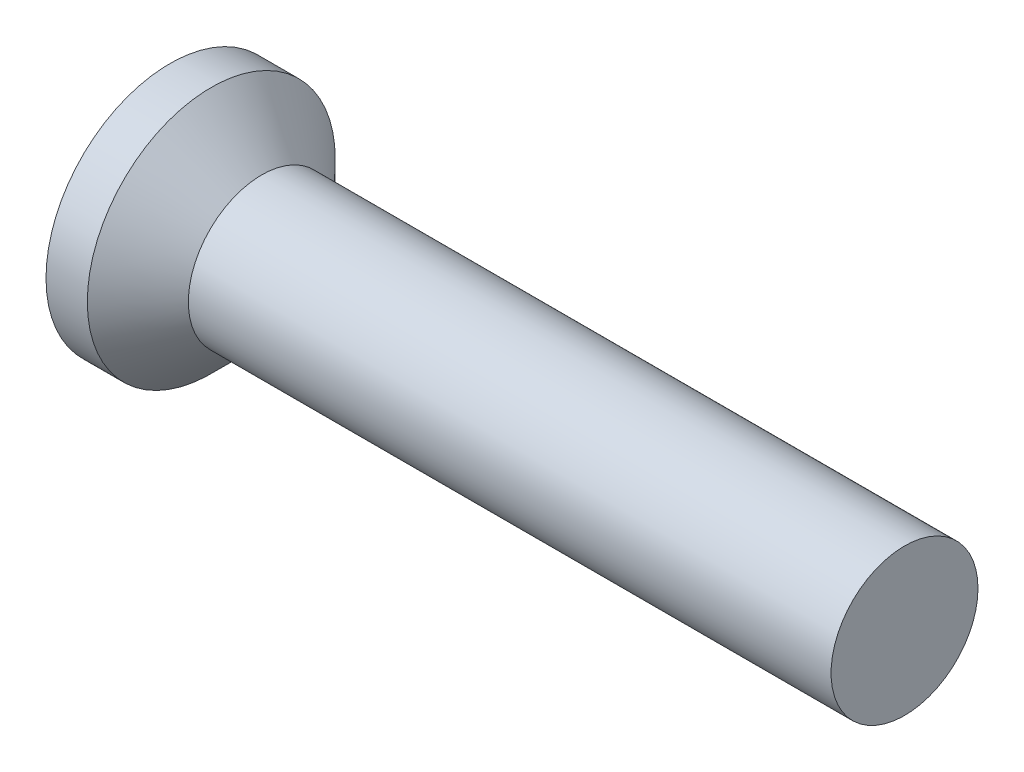
ISO-10303-21;
HEADER;
FILE_DESCRIPTION(('STEP AP214'),'2;1');
FILE_NAME('part.step','',(''),(''),'','','');
FILE_SCHEMA(('AUTOMOTIVE_DESIGN { 1 0 10303 214 1 1 1 1 }'));
ENDSEC;
DATA;
#1=APPLICATION_CONTEXT('core data for automotive mechanical design processes');
#2=APPLICATION_PROTOCOL_DEFINITION('international standard','automotive_design',2000,#1);
#3=PRODUCT_CONTEXT('',#1,'mechanical');
#4=PRODUCT('Part','Part','',(#3));
#5=PRODUCT_RELATED_PRODUCT_CATEGORY('part','',(#4));
#6=PRODUCT_DEFINITION_FORMATION('','',#4);
#7=PRODUCT_DEFINITION_CONTEXT('part definition',#1,'design');
#8=PRODUCT_DEFINITION('design','',#6,#7);
#9=PRODUCT_DEFINITION_SHAPE('','',#8);
#10=(LENGTH_UNIT() NAMED_UNIT(*) SI_UNIT(.MILLI.,.METRE.));
#11=(NAMED_UNIT(*) PLANE_ANGLE_UNIT() SI_UNIT($,.RADIAN.));
#12=(NAMED_UNIT(*) SI_UNIT($,.STERADIAN.) SOLID_ANGLE_UNIT());
#13=UNCERTAINTY_MEASURE_WITH_UNIT(LENGTH_MEASURE(1.E-05),#10,'distance_accuracy_value','');
#14=(GEOMETRIC_REPRESENTATION_CONTEXT(3) GLOBAL_UNCERTAINTY_ASSIGNED_CONTEXT((#13)) GLOBAL_UNIT_ASSIGNED_CONTEXT((#10,
#11,#12)) REPRESENTATION_CONTEXT('',''));
#15=CARTESIAN_POINT('',(0.,0.,0.));
#16=DIRECTION('',(0.,0.,1.));
#17=DIRECTION('',(1.,0.,0.));
#18=AXIS2_PLACEMENT_3D('',#15,#16,#17);
#19=CARTESIAN_POINT('',(0.,1.34999999999999,0.));
#20=DIRECTION('',(-1.,0.,0.));
#21=DIRECTION('',(0.,0.,1.));
#22=AXIS2_PLACEMENT_3D('',#19,#20,#21);
#23=PLANE('',#22);
#24=CARTESIAN_POINT('',(0.,0.,0.));
#25=DIRECTION('',(1.,0.,0.));
#26=DIRECTION('',(0.,0.,-1.));
#27=AXIS2_PLACEMENT_3D('',#24,#25,#26);
#28=CIRCLE('',#27,1.34999999999999);
#29=CARTESIAN_POINT('',(0.,0.,-1.34999999999999));
#30=VERTEX_POINT('',#29);
#31=EDGE_CURVE('E185',#30,#30,#28,.T.);
#32=ORIENTED_EDGE('',*,*,#31,.F.);
#33=EDGE_LOOP('',(#32));
#34=FACE_BOUND('',#33,.T.);
#35=DIRECTION('',(0.,1.,0.));
#36=VECTOR('',#35,1.);
#37=CARTESIAN_POINT('',(0.,-0.16,-0.16));
#38=LINE('',#37,#36);
#39=CARTESIAN_POINT('',(0.,-0.8,-0.16));
#40=VERTEX_POINT('',#39);
#41=CARTESIAN_POINT('',(0.,-0.46,-0.16));
#42=VERTEX_POINT('',#41);
#43=EDGE_CURVE('E311',#40,#42,#38,.T.);
#44=ORIENTED_EDGE('',*,*,#43,.T.);
#45=CARTESIAN_POINT('',(0.,-0.46,-0.46));
#46=DIRECTION('',(-1.,0.,0.));
#47=DIRECTION('',(0.,0.,1.));
#48=AXIS2_PLACEMENT_3D('',#45,#46,#47);
#49=CIRCLE('',#48,0.3);
#50=CARTESIAN_POINT('',(0.,-0.16,-0.46));
#51=VERTEX_POINT('',#50);
#52=EDGE_CURVE('E190',#42,#51,#49,.T.);
#53=ORIENTED_EDGE('',*,*,#52,.T.);
#54=DIRECTION('',(0.,0.,-1.));
#55=VECTOR('',#54,1.);
#56=CARTESIAN_POINT('',(0.,-0.16,-0.16));
#57=LINE('',#56,#55);
#58=CARTESIAN_POINT('',(0.,-0.16,-0.8));
#59=VERTEX_POINT('',#58);
#60=EDGE_CURVE('E313',#51,#59,#57,.T.);
#61=ORIENTED_EDGE('',*,*,#60,.T.);
#62=DIRECTION('',(0.,1.,0.));
#63=VECTOR('',#62,1.);
#64=CARTESIAN_POINT('',(0.,0.16,-0.8));
#65=LINE('',#64,#63);
#66=CARTESIAN_POINT('',(0.,0.16,-0.8));
#67=VERTEX_POINT('',#66);
#68=EDGE_CURVE('E315',#59,#67,#65,.T.);
#69=ORIENTED_EDGE('',*,*,#68,.T.);
#70=DIRECTION('',(0.,0.,1.));
#71=VECTOR('',#70,1.);
#72=CARTESIAN_POINT('',(0.,0.16,-0.16));
#73=LINE('',#72,#71);
#74=CARTESIAN_POINT('',(0.,0.16,-0.46));
#75=VERTEX_POINT('',#74);
#76=EDGE_CURVE('E318',#67,#75,#73,.T.);
#77=ORIENTED_EDGE('',*,*,#76,.T.);
#78=CARTESIAN_POINT('',(0.,0.46,-0.46));
#79=DIRECTION('',(-1.,0.,0.));
#80=DIRECTION('',(0.,0.,1.));
#81=AXIS2_PLACEMENT_3D('',#78,#79,#80);
#82=CIRCLE('',#81,0.3);
#83=CARTESIAN_POINT('',(0.,0.46,-0.16));
#84=VERTEX_POINT('',#83);
#85=EDGE_CURVE('E188',#75,#84,#82,.T.);
#86=ORIENTED_EDGE('',*,*,#85,.T.);
#87=DIRECTION('',(0.,1.,0.));
#88=VECTOR('',#87,1.);
#89=CARTESIAN_POINT('',(0.,0.16,-0.16));
#90=LINE('',#89,#88);
#91=CARTESIAN_POINT('',(0.,0.8,-0.16));
#92=VERTEX_POINT('',#91);
#93=EDGE_CURVE('E321',#84,#92,#90,.T.);
#94=ORIENTED_EDGE('',*,*,#93,.T.);
#95=DIRECTION('',(0.,0.,1.));
#96=VECTOR('',#95,1.);
#97=CARTESIAN_POINT('',(0.,0.8,-0.16));
#98=LINE('',#97,#96);
#99=CARTESIAN_POINT('',(0.,0.8,0.16));
#100=VERTEX_POINT('',#99);
#101=EDGE_CURVE('E323',#92,#100,#98,.T.);
#102=ORIENTED_EDGE('',*,*,#101,.T.);
#103=DIRECTION('',(0.,-1.,0.));
#104=VECTOR('',#103,1.);
#105=CARTESIAN_POINT('',(0.,0.16,0.16));
#106=LINE('',#105,#104);
#107=CARTESIAN_POINT('',(0.,0.46,0.16));
#108=VERTEX_POINT('',#107);
#109=EDGE_CURVE('E326',#100,#108,#106,.T.);
#110=ORIENTED_EDGE('',*,*,#109,.T.);
#111=CARTESIAN_POINT('',(0.,0.46,0.46));
#112=DIRECTION('',(-1.,0.,0.));
#113=DIRECTION('',(0.,0.,1.));
#114=AXIS2_PLACEMENT_3D('',#111,#112,#113);
#115=CIRCLE('',#114,0.3);
#116=CARTESIAN_POINT('',(0.,0.16,0.46));
#117=VERTEX_POINT('',#116);
#118=EDGE_CURVE('E153',#108,#117,#115,.T.);
#119=ORIENTED_EDGE('',*,*,#118,.T.);
#120=DIRECTION('',(0.,0.,1.));
#121=VECTOR('',#120,1.);
#122=CARTESIAN_POINT('',(0.,0.16,0.16));
#123=LINE('',#122,#121);
#124=CARTESIAN_POINT('',(0.,0.16,0.8));
#125=VERTEX_POINT('',#124);
#126=EDGE_CURVE('E147',#117,#125,#123,.T.);
#127=ORIENTED_EDGE('',*,*,#126,.T.);
#128=DIRECTION('',(0.,-1.,0.));
#129=VECTOR('',#128,1.);
#130=CARTESIAN_POINT('',(0.,0.16,0.8));
#131=LINE('',#130,#129);
#132=CARTESIAN_POINT('',(0.,-0.16,0.8));
#133=VERTEX_POINT('',#132);
#134=EDGE_CURVE('E151',#125,#133,#131,.T.);
#135=ORIENTED_EDGE('',*,*,#134,.T.);
#136=DIRECTION('',(0.,0.,-1.));
#137=VECTOR('',#136,1.);
#138=CARTESIAN_POINT('',(0.,-0.16,0.16));
#139=LINE('',#138,#137);
#140=CARTESIAN_POINT('',(0.,-0.16,0.46));
#141=VERTEX_POINT('',#140);
#142=EDGE_CURVE('E165',#133,#141,#139,.T.);
#143=ORIENTED_EDGE('',*,*,#142,.T.);
#144=CARTESIAN_POINT('',(0.,-0.46,0.46));
#145=DIRECTION('',(-1.,0.,0.));
#146=DIRECTION('',(0.,0.,1.));
#147=AXIS2_PLACEMENT_3D('',#144,#145,#146);
#148=CIRCLE('',#147,0.3);
#149=CARTESIAN_POINT('',(0.,-0.46,0.16));
#150=VERTEX_POINT('',#149);
#151=EDGE_CURVE('E184',#141,#150,#148,.T.);
#152=ORIENTED_EDGE('',*,*,#151,.T.);
#153=DIRECTION('',(0.,-1.,0.));
#154=VECTOR('',#153,1.);
#155=CARTESIAN_POINT('',(0.,-0.16,0.16));
#156=LINE('',#155,#154);
#157=CARTESIAN_POINT('',(0.,-0.8,0.159999999999999));
#158=VERTEX_POINT('',#157);
#159=EDGE_CURVE('E306',#150,#158,#156,.T.);
#160=ORIENTED_EDGE('',*,*,#159,.T.);
#161=DIRECTION('',(0.,0.,-1.));
#162=VECTOR('',#161,1.);
#163=CARTESIAN_POINT('',(0.,-0.8,-0.16));
#164=LINE('',#163,#162);
#165=EDGE_CURVE('E308',#158,#40,#164,.T.);
#166=ORIENTED_EDGE('',*,*,#165,.T.);
#167=EDGE_LOOP('',(#44,#53,#61,#69,#77,#86,#94,#102,#110,#119,#127,#135,#143,#152,#160,#166));
#168=FACE_BOUND('',#167,.T.);
#169=ADVANCED_FACE('F34',(#34,#168),#23,.T.);
#170=CARTESIAN_POINT('',(8.,0.799999999999994,0.));
#171=DIRECTION('',(1.,0.,0.));
#172=DIRECTION('',(0.,0.,-1.));
#173=AXIS2_PLACEMENT_3D('',#170,#171,#172);
#174=PLANE('',#173);
#175=CARTESIAN_POINT('',(7.99999999999999,0.,0.));
#176=DIRECTION('',(1.,0.,0.));
#177=DIRECTION('',(0.,0.,-1.));
#178=AXIS2_PLACEMENT_3D('',#175,#176,#177);
#179=CIRCLE('',#178,0.799999999999994);
#180=CARTESIAN_POINT('',(7.99999999999999,0.,-0.799999999999994));
#181=VERTEX_POINT('',#180);
#182=EDGE_CURVE('E171',#181,#181,#179,.T.);
#183=ORIENTED_EDGE('',*,*,#182,.T.);
#184=EDGE_LOOP('',(#183));
#185=FACE_BOUND('',#184,.T.);
#186=ADVANCED_FACE('F238',(#185),#174,.T.);
#187=CARTESIAN_POINT('',(4.51581291088132,0.,0.));
#188=DIRECTION('',(1.,0.,0.));
#189=DIRECTION('',(0.,0.,-1.));
#190=AXIS2_PLACEMENT_3D('',#187,#188,#189);
#191=CYLINDRICAL_SURFACE('',#190,1.34999999999999);
#192=ORIENTED_EDGE('',*,*,#31,.T.);
#193=EDGE_LOOP('',(#192));
#194=FACE_BOUND('',#193,.T.);
#195=CARTESIAN_POINT('',(0.450000000000002,0.,0.));
#196=DIRECTION('',(1.,0.,0.));
#197=DIRECTION('',(0.,0.,-1.));
#198=AXIS2_PLACEMENT_3D('',#195,#196,#197);
#199=CIRCLE('',#198,1.34999999999999);
#200=CARTESIAN_POINT('',(0.450000000000002,0.,-1.34999999999999));
#201=VERTEX_POINT('',#200);
#202=EDGE_CURVE('E330',#201,#201,#199,.T.);
#203=ORIENTED_EDGE('',*,*,#202,.F.);
#204=EDGE_LOOP('',(#203));
#205=FACE_BOUND('',#204,.T.);
#206=ADVANCED_FACE('F244',(#194,#205),#191,.T.);
#207=CARTESIAN_POINT('',(1.,0.,0.));
#208=DIRECTION('',(-1.,0.,0.));
#209=DIRECTION('',(0.,0.,1.));
#210=AXIS2_PLACEMENT_3D('',#207,#208,#209);
#211=CONICAL_SURFACE('',#210,0.799999999999993,0.785398163397449);
#212=ORIENTED_EDGE('',*,*,#202,.T.);
#213=EDGE_LOOP('',(#212));
#214=FACE_BOUND('',#213,.T.);
#215=CARTESIAN_POINT('',(1.,0.,0.));
#216=DIRECTION('',(1.,0.,0.));
#217=DIRECTION('',(0.,0.,-1.));
#218=AXIS2_PLACEMENT_3D('',#215,#216,#217);
#219=CIRCLE('',#218,0.799999999999993);
#220=CARTESIAN_POINT('',(1.,0.,-0.799999999999993));
#221=VERTEX_POINT('',#220);
#222=EDGE_CURVE('E174',#221,#221,#219,.T.);
#223=ORIENTED_EDGE('',*,*,#222,.F.);
#224=EDGE_LOOP('',(#223));
#225=FACE_BOUND('',#224,.T.);
#226=ADVANCED_FACE('F366',(#214,#225),#211,.T.);
#227=CARTESIAN_POINT('',(4.51581291088132,0.,0.));
#228=DIRECTION('',(1.,0.,0.));
#229=DIRECTION('',(0.,0.,-1.));
#230=AXIS2_PLACEMENT_3D('',#227,#228,#229);
#231=CYLINDRICAL_SURFACE('',#230,0.799999999999994);
#232=ORIENTED_EDGE('',*,*,#222,.T.);
#233=EDGE_LOOP('',(#232));
#234=FACE_BOUND('',#233,.T.);
#235=ORIENTED_EDGE('',*,*,#182,.F.);
#236=EDGE_LOOP('',(#235));
#237=FACE_BOUND('',#236,.T.);
#238=ADVANCED_FACE('F364',(#234,#237),#231,.T.);
#239=CARTESIAN_POINT('',(0.5,0.16,0.16));
#240=DIRECTION('',(0.,-1.,0.));
#241=DIRECTION('',(0.,0.,-1.));
#242=AXIS2_PLACEMENT_3D('',#239,#240,#241);
#243=PLANE('',#242);
#244=ORIENTED_EDGE('',*,*,#126,.F.);
#245=DIRECTION('',(-1.,0.,0.));
#246=VECTOR('',#245,1.);
#247=CARTESIAN_POINT('',(0.5,0.16,0.46));
#248=LINE('',#247,#246);
#249=CARTESIAN_POINT('',(0.5,0.16,0.46));
#250=VERTEX_POINT('',#249);
#251=EDGE_CURVE('E202',#117,#250,#248,.F.);
#252=ORIENTED_EDGE('',*,*,#251,.T.);
#253=DIRECTION('',(0.,0.,1.));
#254=VECTOR('',#253,1.);
#255=CARTESIAN_POINT('',(0.5,0.16,0.16));
#256=LINE('',#255,#254);
#257=CARTESIAN_POINT('',(0.5,0.16,0.511324865405187));
#258=VERTEX_POINT('',#257);
#259=EDGE_CURVE('E169',#250,#258,#256,.T.);
#260=ORIENTED_EDGE('',*,*,#259,.T.);
#261=DIRECTION('',(-0.866025403784438,0.,0.500000000000001));
#262=VECTOR('',#261,1.);
#263=CARTESIAN_POINT('',(0.,0.16,0.8));
#264=LINE('',#263,#262);
#265=EDGE_CURVE('E161',#258,#125,#264,.T.);
#266=ORIENTED_EDGE('',*,*,#265,.T.);
#267=EDGE_LOOP('',(#244,#252,#260,#266));
#268=FACE_BOUND('',#267,.T.);
#269=ADVANCED_FACE('F167',(#268),#243,.T.);
#270=CARTESIAN_POINT('',(0.,0.16,0.8));
#271=DIRECTION('',(-0.500000000000001,0.,-0.866025403784438));
#272=DIRECTION('',(-0.866025403784438,0.,0.500000000000001));
#273=AXIS2_PLACEMENT_3D('',#270,#271,#272);
#274=PLANE('',#273);
#275=ORIENTED_EDGE('',*,*,#134,.F.);
#276=ORIENTED_EDGE('',*,*,#265,.F.);
#277=DIRECTION('',(0.,-1.,0.));
#278=VECTOR('',#277,1.);
#279=CARTESIAN_POINT('',(0.5,0.16,0.511324865405187));
#280=LINE('',#279,#278);
#281=CARTESIAN_POINT('',(0.5,-0.16,0.511324865405187));
#282=VERTEX_POINT('',#281);
#283=EDGE_CURVE('E180',#258,#282,#280,.T.);
#284=ORIENTED_EDGE('',*,*,#283,.T.);
#285=DIRECTION('',(-0.866025403784438,0.,0.500000000000001));
#286=VECTOR('',#285,1.);
#287=CARTESIAN_POINT('',(0.65212812921102,-0.16,0.42349364905389));
#288=LINE('',#287,#286);
#289=EDGE_CURVE('E163',#282,#133,#288,.T.);
#290=ORIENTED_EDGE('',*,*,#289,.T.);
#291=EDGE_LOOP('',(#275,#276,#284,#290));
#292=FACE_BOUND('',#291,.T.);
#293=ADVANCED_FACE('F160',(#292),#274,.T.);
#294=CARTESIAN_POINT('',(0.5,-0.16,0.16));
#295=DIRECTION('',(0.,1.,0.));
#296=DIRECTION('',(0.,0.,1.));
#297=AXIS2_PLACEMENT_3D('',#294,#295,#296);
#298=PLANE('',#297);
#299=DIRECTION('',(0.,0.,-1.));
#300=VECTOR('',#299,1.);
#301=CARTESIAN_POINT('',(0.5,-0.16,0.16));
#302=LINE('',#301,#300);
#303=CARTESIAN_POINT('',(0.5,-0.16,0.46));
#304=VERTEX_POINT('',#303);
#305=EDGE_CURVE('E352',#282,#304,#302,.T.);
#306=ORIENTED_EDGE('',*,*,#305,.T.);
#307=DIRECTION('',(-1.,0.,0.));
#308=VECTOR('',#307,1.);
#309=CARTESIAN_POINT('',(0.5,-0.16,0.46));
#310=LINE('',#309,#308);
#311=EDGE_CURVE('E204',#304,#141,#310,.T.);
#312=ORIENTED_EDGE('',*,*,#311,.T.);
#313=ORIENTED_EDGE('',*,*,#142,.F.);
#314=ORIENTED_EDGE('',*,*,#289,.F.);
#315=EDGE_LOOP('',(#306,#312,#313,#314));
#316=FACE_BOUND('',#315,.T.);
#317=ADVANCED_FACE('F258',(#316),#298,.T.);
#318=CARTESIAN_POINT('',(0.5,-0.16,0.16));
#319=DIRECTION('',(0.,0.,-1.));
#320=DIRECTION('',(0.,1.,0.));
#321=AXIS2_PLACEMENT_3D('',#318,#319,#320);
#322=PLANE('',#321);
#323=ORIENTED_EDGE('',*,*,#159,.F.);
#324=DIRECTION('',(-1.,0.,0.));
#325=VECTOR('',#324,1.);
#326=CARTESIAN_POINT('',(0.5,-0.46,0.16));
#327=LINE('',#326,#325);
#328=CARTESIAN_POINT('',(0.5,-0.46,0.16));
#329=VERTEX_POINT('',#328);
#330=EDGE_CURVE('E49',#150,#329,#327,.F.);
#331=ORIENTED_EDGE('',*,*,#330,.T.);
#332=DIRECTION('',(0.,-1.,0.));
#333=VECTOR('',#332,1.);
#334=CARTESIAN_POINT('',(0.5,-0.16,0.16));
#335=LINE('',#334,#333);
#336=CARTESIAN_POINT('',(0.5,-0.511324865405187,0.16));
#337=VERTEX_POINT('',#336);
#338=EDGE_CURVE('E295',#329,#337,#335,.T.);
#339=ORIENTED_EDGE('',*,*,#338,.T.);
#340=DIRECTION('',(-0.866025403784438,-0.500000000000001,0.));
#341=VECTOR('',#340,1.);
#342=CARTESIAN_POINT('',(0.,-0.8,0.159999999999999));
#343=LINE('',#342,#341);
#344=EDGE_CURVE('E176',#337,#158,#343,.T.);
#345=ORIENTED_EDGE('',*,*,#344,.T.);
#346=EDGE_LOOP('',(#323,#331,#339,#345));
#347=FACE_BOUND('',#346,.T.);
#348=ADVANCED_FACE('F263',(#347),#322,.T.);
#349=CARTESIAN_POINT('',(0.,-0.8,-0.16));
#350=DIRECTION('',(-0.500000000000001,0.866025403784438,0.));
#351=DIRECTION('',(-0.866025403784438,-0.500000000000001,0.));
#352=AXIS2_PLACEMENT_3D('',#349,#350,#351);
#353=PLANE('',#352);
#354=ORIENTED_EDGE('',*,*,#165,.F.);
#355=ORIENTED_EDGE('',*,*,#344,.F.);
#356=DIRECTION('',(0.,0.,-1.));
#357=VECTOR('',#356,1.);
#358=CARTESIAN_POINT('',(0.5,-0.511324865405187,-0.16));
#359=LINE('',#358,#357);
#360=CARTESIAN_POINT('',(0.5,-0.511324865405187,-0.16));
#361=VERTEX_POINT('',#360);
#362=EDGE_CURVE('E291',#337,#361,#359,.T.);
#363=ORIENTED_EDGE('',*,*,#362,.T.);
#364=DIRECTION('',(-0.866025403784438,-0.500000000000001,0.));
#365=VECTOR('',#364,1.);
#366=CARTESIAN_POINT('',(0.65212812921102,-0.42349364905389,-0.16));
#367=LINE('',#366,#365);
#368=EDGE_CURVE('E290',#361,#40,#367,.T.);
#369=ORIENTED_EDGE('',*,*,#368,.T.);
#370=EDGE_LOOP('',(#354,#355,#363,#369));
#371=FACE_BOUND('',#370,.T.);
#372=ADVANCED_FACE('F259',(#371),#353,.T.);
#373=CARTESIAN_POINT('',(0.5,-0.16,-0.16));
#374=DIRECTION('',(0.,0.,1.));
#375=DIRECTION('',(0.,-1.,0.));
#376=AXIS2_PLACEMENT_3D('',#373,#374,#375);
#377=PLANE('',#376);
#378=DIRECTION('',(0.,1.,0.));
#379=VECTOR('',#378,1.);
#380=CARTESIAN_POINT('',(0.5,-0.16,-0.16));
#381=LINE('',#380,#379);
#382=CARTESIAN_POINT('',(0.5,-0.46,-0.16));
#383=VERTEX_POINT('',#382);
#384=EDGE_CURVE('E284',#361,#383,#381,.T.);
#385=ORIENTED_EDGE('',*,*,#384,.T.);
#386=DIRECTION('',(-1.,0.,0.));
#387=VECTOR('',#386,1.);
#388=CARTESIAN_POINT('',(0.5,-0.46,-0.16));
#389=LINE('',#388,#387);
#390=EDGE_CURVE('E181',#383,#42,#389,.T.);
#391=ORIENTED_EDGE('',*,*,#390,.T.);
#392=ORIENTED_EDGE('',*,*,#43,.F.);
#393=ORIENTED_EDGE('',*,*,#368,.F.);
#394=EDGE_LOOP('',(#385,#391,#392,#393));
#395=FACE_BOUND('',#394,.T.);
#396=ADVANCED_FACE('F262',(#395),#377,.T.);
#397=CARTESIAN_POINT('',(0.5,-0.16,-0.16));
#398=DIRECTION('',(0.,1.,0.));
#399=DIRECTION('',(0.,0.,1.));
#400=AXIS2_PLACEMENT_3D('',#397,#398,#399);
#401=PLANE('',#400);
#402=ORIENTED_EDGE('',*,*,#60,.F.);
#403=DIRECTION('',(-1.,0.,0.));
#404=VECTOR('',#403,1.);
#405=CARTESIAN_POINT('',(0.5,-0.16,-0.46));
#406=LINE('',#405,#404);
#407=CARTESIAN_POINT('',(0.5,-0.16,-0.46));
#408=VERTEX_POINT('',#407);
#409=EDGE_CURVE('E192',#51,#408,#406,.F.);
#410=ORIENTED_EDGE('',*,*,#409,.T.);
#411=DIRECTION('',(0.,0.,-1.));
#412=VECTOR('',#411,1.);
#413=CARTESIAN_POINT('',(0.5,-0.16,-0.16));
#414=LINE('',#413,#412);
#415=CARTESIAN_POINT('',(0.5,-0.16,-0.511324865405187));
#416=VERTEX_POINT('',#415);
#417=EDGE_CURVE('E286',#408,#416,#414,.T.);
#418=ORIENTED_EDGE('',*,*,#417,.T.);
#419=DIRECTION('',(-0.866025403784438,0.,-0.500000000000001));
#420=VECTOR('',#419,1.);
#421=CARTESIAN_POINT('',(0.,-0.16,-0.8));
#422=LINE('',#421,#420);
#423=EDGE_CURVE('E342',#416,#59,#422,.T.);
#424=ORIENTED_EDGE('',*,*,#423,.T.);
#425=EDGE_LOOP('',(#402,#410,#418,#424));
#426=FACE_BOUND('',#425,.T.);
#427=ADVANCED_FACE('F269',(#426),#401,.T.);
#428=CARTESIAN_POINT('',(0.,0.16,-0.8));
#429=DIRECTION('',(-0.500000000000001,0.,0.866025403784438));
#430=DIRECTION('',(0.866025403784438,0.,0.500000000000001));
#431=AXIS2_PLACEMENT_3D('',#428,#429,#430);
#432=PLANE('',#431);
#433=ORIENTED_EDGE('',*,*,#68,.F.);
#434=ORIENTED_EDGE('',*,*,#423,.F.);
#435=DIRECTION('',(0.,1.,0.));
#436=VECTOR('',#435,1.);
#437=CARTESIAN_POINT('',(0.5,0.16,-0.511324865405187));
#438=LINE('',#437,#436);
#439=CARTESIAN_POINT('',(0.5,0.16,-0.511324865405187));
#440=VERTEX_POINT('',#439);
#441=EDGE_CURVE('E293',#416,#440,#438,.T.);
#442=ORIENTED_EDGE('',*,*,#441,.T.);
#443=DIRECTION('',(-0.866025403784438,0.,-0.500000000000001));
#444=VECTOR('',#443,1.);
#445=CARTESIAN_POINT('',(0.65212812921102,0.16,-0.42349364905389));
#446=LINE('',#445,#444);
#447=EDGE_CURVE('E340',#440,#67,#446,.T.);
#448=ORIENTED_EDGE('',*,*,#447,.T.);
#449=EDGE_LOOP('',(#433,#434,#442,#448));
#450=FACE_BOUND('',#449,.T.);
#451=ADVANCED_FACE('F265',(#450),#432,.T.);
#452=CARTESIAN_POINT('',(0.5,0.16,-0.16));
#453=DIRECTION('',(0.,-1.,0.));
#454=DIRECTION('',(0.,0.,-1.));
#455=AXIS2_PLACEMENT_3D('',#452,#453,#454);
#456=PLANE('',#455);
#457=DIRECTION('',(0.,0.,1.));
#458=VECTOR('',#457,1.);
#459=CARTESIAN_POINT('',(0.5,0.16,-0.16));
#460=LINE('',#459,#458);
#461=CARTESIAN_POINT('',(0.5,0.16,-0.46));
#462=VERTEX_POINT('',#461);
#463=EDGE_CURVE('E300',#440,#462,#460,.T.);
#464=ORIENTED_EDGE('',*,*,#463,.T.);
#465=DIRECTION('',(-1.,0.,0.));
#466=VECTOR('',#465,1.);
#467=CARTESIAN_POINT('',(0.5,0.16,-0.46));
#468=LINE('',#467,#466);
#469=EDGE_CURVE('E194',#462,#75,#468,.T.);
#470=ORIENTED_EDGE('',*,*,#469,.T.);
#471=ORIENTED_EDGE('',*,*,#76,.F.);
#472=ORIENTED_EDGE('',*,*,#447,.F.);
#473=EDGE_LOOP('',(#464,#470,#471,#472));
#474=FACE_BOUND('',#473,.T.);
#475=ADVANCED_FACE('F268',(#474),#456,.T.);
#476=CARTESIAN_POINT('',(0.5,0.16,-0.16));
#477=DIRECTION('',(0.,0.,1.));
#478=DIRECTION('',(0.,-1.,0.));
#479=AXIS2_PLACEMENT_3D('',#476,#477,#478);
#480=PLANE('',#479);
#481=ORIENTED_EDGE('',*,*,#93,.F.);
#482=DIRECTION('',(-1.,0.,0.));
#483=VECTOR('',#482,1.);
#484=CARTESIAN_POINT('',(0.5,0.46,-0.16));
#485=LINE('',#484,#483);
#486=CARTESIAN_POINT('',(0.5,0.46,-0.16));
#487=VERTEX_POINT('',#486);
#488=EDGE_CURVE('E197',#84,#487,#485,.F.);
#489=ORIENTED_EDGE('',*,*,#488,.T.);
#490=DIRECTION('',(0.,1.,0.));
#491=VECTOR('',#490,1.);
#492=CARTESIAN_POINT('',(0.5,0.16,-0.16));
#493=LINE('',#492,#491);
#494=CARTESIAN_POINT('',(0.5,0.511324865405187,-0.16));
#495=VERTEX_POINT('',#494);
#496=EDGE_CURVE('E303',#487,#495,#493,.T.);
#497=ORIENTED_EDGE('',*,*,#496,.T.);
#498=DIRECTION('',(-0.866025403784438,0.500000000000001,0.));
#499=VECTOR('',#498,1.);
#500=CARTESIAN_POINT('',(0.,0.8,-0.16));
#501=LINE('',#500,#499);
#502=EDGE_CURVE('E336',#495,#92,#501,.T.);
#503=ORIENTED_EDGE('',*,*,#502,.T.);
#504=EDGE_LOOP('',(#481,#489,#497,#503));
#505=FACE_BOUND('',#504,.T.);
#506=ADVANCED_FACE('F254',(#505),#480,.T.);
#507=CARTESIAN_POINT('',(0.,0.8,-0.16));
#508=DIRECTION('',(-0.500000000000001,-0.866025403784438,0.));
#509=DIRECTION('',(0.866025403784438,-0.500000000000001,0.));
#510=AXIS2_PLACEMENT_3D('',#507,#508,#509);
#511=PLANE('',#510);
#512=ORIENTED_EDGE('',*,*,#101,.F.);
#513=ORIENTED_EDGE('',*,*,#502,.F.);
#514=DIRECTION('',(0.,0.,1.));
#515=VECTOR('',#514,1.);
#516=CARTESIAN_POINT('',(0.5,0.511324865405187,-0.16));
#517=LINE('',#516,#515);
#518=CARTESIAN_POINT('',(0.5,0.511324865405187,0.16));
#519=VERTEX_POINT('',#518);
#520=EDGE_CURVE('E224',#495,#519,#517,.T.);
#521=ORIENTED_EDGE('',*,*,#520,.T.);
#522=DIRECTION('',(-0.866025403784438,0.500000000000001,0.));
#523=VECTOR('',#522,1.);
#524=CARTESIAN_POINT('',(0.65212812921102,0.42349364905389,0.16));
#525=LINE('',#524,#523);
#526=EDGE_CURVE('E223',#519,#100,#525,.T.);
#527=ORIENTED_EDGE('',*,*,#526,.T.);
#528=EDGE_LOOP('',(#512,#513,#521,#527));
#529=FACE_BOUND('',#528,.T.);
#530=ADVANCED_FACE('F251',(#529),#511,.T.);
#531=CARTESIAN_POINT('',(0.5,0.16,0.16));
#532=DIRECTION('',(0.,0.,-1.));
#533=DIRECTION('',(-1.,0.,0.));
#534=AXIS2_PLACEMENT_3D('',#531,#532,#533);
#535=PLANE('',#534);
#536=DIRECTION('',(0.,-1.,0.));
#537=VECTOR('',#536,1.);
#538=CARTESIAN_POINT('',(0.5,0.16,0.16));
#539=LINE('',#538,#537);
#540=CARTESIAN_POINT('',(0.5,0.46,0.16));
#541=VERTEX_POINT('',#540);
#542=EDGE_CURVE('E216',#519,#541,#539,.T.);
#543=ORIENTED_EDGE('',*,*,#542,.T.);
#544=DIRECTION('',(-1.,0.,0.));
#545=VECTOR('',#544,1.);
#546=CARTESIAN_POINT('',(0.5,0.46,0.16));
#547=LINE('',#546,#545);
#548=EDGE_CURVE('E199',#541,#108,#547,.T.);
#549=ORIENTED_EDGE('',*,*,#548,.T.);
#550=ORIENTED_EDGE('',*,*,#109,.F.);
#551=ORIENTED_EDGE('',*,*,#526,.F.);
#552=EDGE_LOOP('',(#543,#549,#550,#551));
#553=FACE_BOUND('',#552,.T.);
#554=ADVANCED_FACE('F221',(#553),#535,.T.);
#555=CARTESIAN_POINT('',(0.5,0.16,-0.16));
#556=DIRECTION('',(-1.,0.,0.));
#557=DIRECTION('',(0.,0.,1.));
#558=AXIS2_PLACEMENT_3D('',#555,#556,#557);
#559=PLANE('',#558);
#560=ORIENTED_EDGE('',*,*,#259,.F.);
#561=CARTESIAN_POINT('',(0.5,0.46,0.46));
#562=DIRECTION('',(-1.,0.,0.));
#563=DIRECTION('',(0.,0.,1.));
#564=AXIS2_PLACEMENT_3D('',#561,#562,#563);
#565=CIRCLE('',#564,0.3);
#566=EDGE_CURVE('E42',#250,#541,#565,.F.);
#567=ORIENTED_EDGE('',*,*,#566,.T.);
#568=ORIENTED_EDGE('',*,*,#542,.F.);
#569=ORIENTED_EDGE('',*,*,#520,.F.);
#570=ORIENTED_EDGE('',*,*,#496,.F.);
#571=CARTESIAN_POINT('',(0.5,0.46,-0.46));
#572=DIRECTION('',(-1.,0.,0.));
#573=DIRECTION('',(0.,0.,1.));
#574=AXIS2_PLACEMENT_3D('',#571,#572,#573);
#575=CIRCLE('',#574,0.3);
#576=EDGE_CURVE('E210',#487,#462,#575,.F.);
#577=ORIENTED_EDGE('',*,*,#576,.T.);
#578=ORIENTED_EDGE('',*,*,#463,.F.);
#579=ORIENTED_EDGE('',*,*,#441,.F.);
#580=ORIENTED_EDGE('',*,*,#417,.F.);
#581=CARTESIAN_POINT('',(0.5,-0.46,-0.46));
#582=DIRECTION('',(-1.,0.,0.));
#583=DIRECTION('',(0.,0.,1.));
#584=AXIS2_PLACEMENT_3D('',#581,#582,#583);
#585=CIRCLE('',#584,0.3);
#586=EDGE_CURVE('E208',#408,#383,#585,.F.);
#587=ORIENTED_EDGE('',*,*,#586,.T.);
#588=ORIENTED_EDGE('',*,*,#384,.F.);
#589=ORIENTED_EDGE('',*,*,#362,.F.);
#590=ORIENTED_EDGE('',*,*,#338,.F.);
#591=CARTESIAN_POINT('',(0.5,-0.46,0.46));
#592=DIRECTION('',(-1.,0.,0.));
#593=DIRECTION('',(0.,0.,1.));
#594=AXIS2_PLACEMENT_3D('',#591,#592,#593);
#595=CIRCLE('',#594,0.3);
#596=EDGE_CURVE('E11',#329,#304,#595,.F.);
#597=ORIENTED_EDGE('',*,*,#596,.T.);
#598=ORIENTED_EDGE('',*,*,#305,.F.);
#599=ORIENTED_EDGE('',*,*,#283,.F.);
#600=EDGE_LOOP('',(#560,#567,#568,#569,#570,#577,#578,#579,#580,#587,#588,#589,#590,#597,#598,#599));
#601=FACE_BOUND('',#600,.T.);
#602=ADVANCED_FACE('F214',(#601),#559,.T.);
#603=CARTESIAN_POINT('',(0.5,-0.46,-0.46));
#604=DIRECTION('',(-1.,0.,0.));
#605=DIRECTION('',(0.,0.,1.));
#606=AXIS2_PLACEMENT_3D('',#603,#604,#605);
#607=CYLINDRICAL_SURFACE('',#606,0.3);
#608=ORIENTED_EDGE('',*,*,#586,.F.);
#609=ORIENTED_EDGE('',*,*,#409,.F.);
#610=ORIENTED_EDGE('',*,*,#52,.F.);
#611=ORIENTED_EDGE('',*,*,#390,.F.);
#612=EDGE_LOOP('',(#608,#609,#610,#611));
#613=FACE_BOUND('',#612,.T.);
#614=ADVANCED_FACE('F234',(#613),#607,.T.);
#615=CARTESIAN_POINT('',(0.5,0.46,-0.46));
#616=DIRECTION('',(-1.,0.,0.));
#617=DIRECTION('',(0.,0.,1.));
#618=AXIS2_PLACEMENT_3D('',#615,#616,#617);
#619=CYLINDRICAL_SURFACE('',#618,0.3);
#620=ORIENTED_EDGE('',*,*,#576,.F.);
#621=ORIENTED_EDGE('',*,*,#488,.F.);
#622=ORIENTED_EDGE('',*,*,#85,.F.);
#623=ORIENTED_EDGE('',*,*,#469,.F.);
#624=EDGE_LOOP('',(#620,#621,#622,#623));
#625=FACE_BOUND('',#624,.T.);
#626=ADVANCED_FACE('F228',(#625),#619,.T.);
#627=CARTESIAN_POINT('',(0.5,0.46,0.46));
#628=DIRECTION('',(-1.,0.,0.));
#629=DIRECTION('',(0.,0.,1.));
#630=AXIS2_PLACEMENT_3D('',#627,#628,#629);
#631=CYLINDRICAL_SURFACE('',#630,0.3);
#632=ORIENTED_EDGE('',*,*,#566,.F.);
#633=ORIENTED_EDGE('',*,*,#251,.F.);
#634=ORIENTED_EDGE('',*,*,#118,.F.);
#635=ORIENTED_EDGE('',*,*,#548,.F.);
#636=EDGE_LOOP('',(#632,#633,#634,#635));
#637=FACE_BOUND('',#636,.T.);
#638=ADVANCED_FACE('F226',(#637),#631,.T.);
#639=CARTESIAN_POINT('',(0.5,-0.46,0.46));
#640=DIRECTION('',(-1.,0.,0.));
#641=DIRECTION('',(0.,0.,1.));
#642=AXIS2_PLACEMENT_3D('',#639,#640,#641);
#643=CYLINDRICAL_SURFACE('',#642,0.3);
#644=ORIENTED_EDGE('',*,*,#596,.F.);
#645=ORIENTED_EDGE('',*,*,#330,.F.);
#646=ORIENTED_EDGE('',*,*,#151,.F.);
#647=ORIENTED_EDGE('',*,*,#311,.F.);
#648=EDGE_LOOP('',(#644,#645,#646,#647));
#649=FACE_BOUND('',#648,.T.);
#650=ADVANCED_FACE('F36',(#649),#643,.T.);
#651=CLOSED_SHELL('',(#169,#186,#206,#226,#238,#269,#293,#317,#348,#372,#396,#427,#451,#475,
#506,#530,#554,#602,#614,#626,#638,#650));
#652=MANIFOLD_SOLID_BREP('B2',#651);
#653=ADVANCED_BREP_SHAPE_REPRESENTATION('',(#18,#652),#14);
#654=SHAPE_DEFINITION_REPRESENTATION(#9,#653);
ENDSEC;
END-ISO-10303-21;
